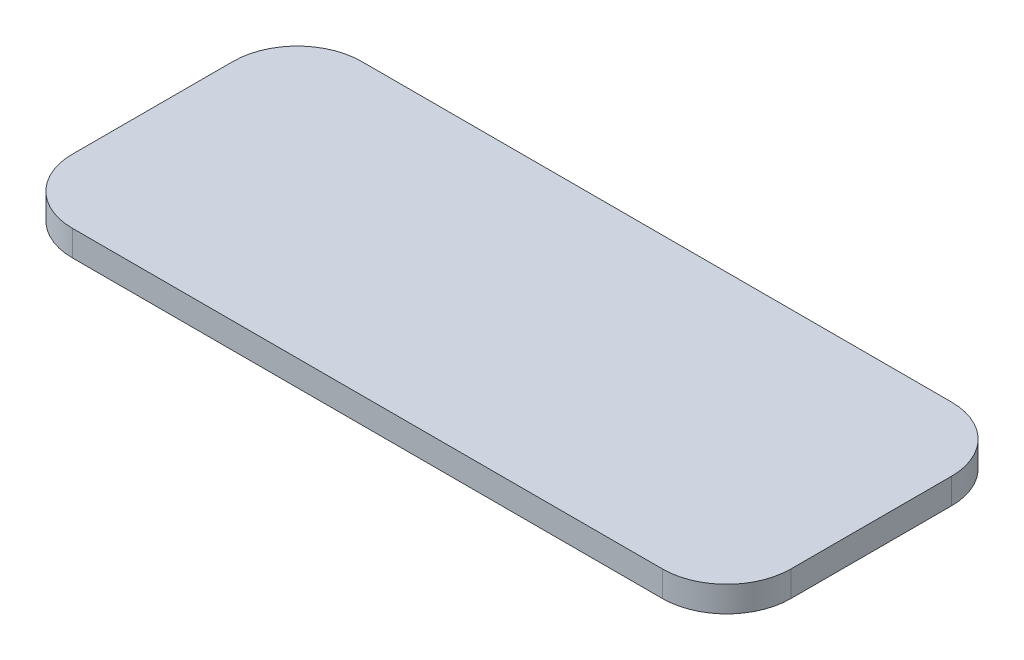
ISO-10303-21;
HEADER;
FILE_DESCRIPTION(('STEP AP214'),'2;1');
FILE_NAME('part.step','',(''),(''),'','','');
FILE_SCHEMA(('AUTOMOTIVE_DESIGN { 1 0 10303 214 1 1 1 1 }'));
ENDSEC;
DATA;
#1=APPLICATION_CONTEXT('core data for automotive mechanical design processes');
#2=APPLICATION_PROTOCOL_DEFINITION('international standard','automotive_design',2000,#1);
#3=PRODUCT_CONTEXT('',#1,'mechanical');
#4=PRODUCT('Part','Part','',(#3));
#5=PRODUCT_RELATED_PRODUCT_CATEGORY('part','',(#4));
#6=PRODUCT_DEFINITION_FORMATION('','',#4);
#7=PRODUCT_DEFINITION_CONTEXT('part definition',#1,'design');
#8=PRODUCT_DEFINITION('design','',#6,#7);
#9=PRODUCT_DEFINITION_SHAPE('','',#8);
#10=(LENGTH_UNIT() NAMED_UNIT(*) SI_UNIT(.MILLI.,.METRE.));
#11=(NAMED_UNIT(*) PLANE_ANGLE_UNIT() SI_UNIT($,.RADIAN.));
#12=(NAMED_UNIT(*) SI_UNIT($,.STERADIAN.) SOLID_ANGLE_UNIT());
#13=UNCERTAINTY_MEASURE_WITH_UNIT(LENGTH_MEASURE(1.E-05),#10,'distance_accuracy_value','');
#14=(GEOMETRIC_REPRESENTATION_CONTEXT(3) GLOBAL_UNCERTAINTY_ASSIGNED_CONTEXT((#13)) GLOBAL_UNIT_ASSIGNED_CONTEXT((#10,
#11,#12)) REPRESENTATION_CONTEXT('',''));
#15=CARTESIAN_POINT('',(0.,0.,0.));
#16=DIRECTION('',(0.,0.,1.));
#17=DIRECTION('',(1.,0.,0.));
#18=AXIS2_PLACEMENT_3D('',#15,#16,#17);
#19=CARTESIAN_POINT('',(29.8350195325224,2.,13.4832919551354));
#20=DIRECTION('',(0.,-1.,0.));
#21=DIRECTION('',(0.,0.,-1.));
#22=AXIS2_PLACEMENT_3D('',#19,#20,#21);
#23=CYLINDRICAL_SURFACE('',#22,5.);
#24=CARTESIAN_POINT('',(29.8350195325224,0.,13.4832919551354));
#25=DIRECTION('',(0.,1.,0.));
#26=DIRECTION('',(0.,0.,-1.));
#27=AXIS2_PLACEMENT_3D('',#24,#25,#26);
#28=CIRCLE('',#27,5.);
#29=CARTESIAN_POINT('',(29.8350195325224,0.,18.4832919551354));
#30=VERTEX_POINT('',#29);
#31=CARTESIAN_POINT('',(34.8350195325224,0.,13.4832919551354));
#32=VERTEX_POINT('',#31);
#33=EDGE_CURVE('E129',#30,#32,#28,.T.);
#34=ORIENTED_EDGE('',*,*,#33,.T.);
#35=DIRECTION('',(0.,-1.,0.));
#36=VECTOR('',#35,1.);
#37=CARTESIAN_POINT('',(34.8350195325224,2.,13.4832919551354));
#38=LINE('',#37,#36);
#39=CARTESIAN_POINT('',(34.8350195325224,2.,13.4832919551354));
#40=VERTEX_POINT('',#39);
#41=EDGE_CURVE('E11',#40,#32,#38,.T.);
#42=ORIENTED_EDGE('',*,*,#41,.F.);
#43=CARTESIAN_POINT('',(29.8350195325224,2.,13.4832919551354));
#44=DIRECTION('',(0.,1.,0.));
#45=DIRECTION('',(0.,0.,-1.));
#46=AXIS2_PLACEMENT_3D('',#43,#44,#45);
#47=CIRCLE('',#46,5.);
#48=CARTESIAN_POINT('',(29.8350195325224,2.,18.4832919551354));
#49=VERTEX_POINT('',#48);
#50=EDGE_CURVE('E143',#49,#40,#47,.T.);
#51=ORIENTED_EDGE('',*,*,#50,.F.);
#52=DIRECTION('',(0.,-1.,0.));
#53=VECTOR('',#52,1.);
#54=CARTESIAN_POINT('',(29.8350195325224,2.,18.4832919551354));
#55=LINE('',#54,#53);
#56=EDGE_CURVE('E125',#49,#30,#55,.T.);
#57=ORIENTED_EDGE('',*,*,#56,.T.);
#58=EDGE_LOOP('',(#34,#42,#51,#57));
#59=FACE_BOUND('',#58,.T.);
#60=ADVANCED_FACE('F33',(#59),#23,.T.);
#61=CARTESIAN_POINT('',(34.8350195325224,2.,0.968460178403462));
#62=DIRECTION('',(-1.,0.,0.));
#63=DIRECTION('',(0.,0.,1.));
#64=AXIS2_PLACEMENT_3D('',#61,#62,#63);
#65=PLANE('',#64);
#66=DIRECTION('',(0.,0.,-1.));
#67=VECTOR('',#66,1.);
#68=CARTESIAN_POINT('',(34.8350195325224,0.,0.968460178403462));
#69=LINE('',#68,#67);
#70=CARTESIAN_POINT('',(34.8350195325224,0.,0.968460178403462));
#71=VERTEX_POINT('',#70);
#72=EDGE_CURVE('E132',#32,#71,#69,.T.);
#73=ORIENTED_EDGE('',*,*,#72,.T.);
#74=DIRECTION('',(0.,-1.,0.));
#75=VECTOR('',#74,1.);
#76=CARTESIAN_POINT('',(34.8350195325224,2.,0.968460178403462));
#77=LINE('',#76,#75);
#78=CARTESIAN_POINT('',(34.8350195325224,2.,0.968460178403462));
#79=VERTEX_POINT('',#78);
#80=EDGE_CURVE('E41',#79,#71,#77,.T.);
#81=ORIENTED_EDGE('',*,*,#80,.F.);
#82=DIRECTION('',(0.,0.,-1.));
#83=VECTOR('',#82,1.);
#84=CARTESIAN_POINT('',(34.8350195325224,2.,0.968460178403462));
#85=LINE('',#84,#83);
#86=EDGE_CURVE('E92',#40,#79,#85,.T.);
#87=ORIENTED_EDGE('',*,*,#86,.F.);
#88=ORIENTED_EDGE('',*,*,#41,.T.);
#89=EDGE_LOOP('',(#73,#81,#87,#88));
#90=FACE_BOUND('',#89,.T.);
#91=ADVANCED_FACE('F178',(#90),#65,.F.);
#92=CARTESIAN_POINT('',(29.8350195325224,2.,0.968460178403462));
#93=DIRECTION('',(0.,-1.,0.));
#94=DIRECTION('',(0.,0.,-1.));
#95=AXIS2_PLACEMENT_3D('',#92,#93,#94);
#96=CYLINDRICAL_SURFACE('',#95,5.);
#97=CARTESIAN_POINT('',(29.8350195325224,0.,0.968460178403462));
#98=DIRECTION('',(0.,1.,0.));
#99=DIRECTION('',(0.,0.,-1.));
#100=AXIS2_PLACEMENT_3D('',#97,#98,#99);
#101=CIRCLE('',#100,5.);
#102=CARTESIAN_POINT('',(29.8350195325224,0.,-4.03153982159654));
#103=VERTEX_POINT('',#102);
#104=EDGE_CURVE('E134',#71,#103,#101,.T.);
#105=ORIENTED_EDGE('',*,*,#104,.T.);
#106=DIRECTION('',(0.,-1.,0.));
#107=VECTOR('',#106,1.);
#108=CARTESIAN_POINT('',(29.8350195325224,2.,-4.03153982159654));
#109=LINE('',#108,#107);
#110=CARTESIAN_POINT('',(29.8350195325224,2.,-4.03153982159654));
#111=VERTEX_POINT('',#110);
#112=EDGE_CURVE('E150',#111,#103,#109,.T.);
#113=ORIENTED_EDGE('',*,*,#112,.F.);
#114=CARTESIAN_POINT('',(29.8350195325224,2.,0.968460178403462));
#115=DIRECTION('',(0.,1.,0.));
#116=DIRECTION('',(0.,0.,-1.));
#117=AXIS2_PLACEMENT_3D('',#114,#115,#116);
#118=CIRCLE('',#117,5.);
#119=EDGE_CURVE('E158',#79,#111,#118,.T.);
#120=ORIENTED_EDGE('',*,*,#119,.F.);
#121=ORIENTED_EDGE('',*,*,#80,.T.);
#122=EDGE_LOOP('',(#105,#113,#120,#121));
#123=FACE_BOUND('',#122,.T.);
#124=ADVANCED_FACE('F156',(#123),#96,.T.);
#125=CARTESIAN_POINT('',(-16.1208689950695,2.,-4.03153982159622));
#126=DIRECTION('',(0.,0.,1.));
#127=DIRECTION('',(1.,0.,0.));
#128=AXIS2_PLACEMENT_3D('',#125,#126,#127);
#129=PLANE('',#128);
#130=DIRECTION('',(-1.,0.,0.));
#131=VECTOR('',#130,1.);
#132=CARTESIAN_POINT('',(-16.1208689950695,0.,-4.03153982159622));
#133=LINE('',#132,#131);
#134=CARTESIAN_POINT('',(-16.1208689950695,0.,-4.03153982159622));
#135=VERTEX_POINT('',#134);
#136=EDGE_CURVE('E136',#103,#135,#133,.T.);
#137=ORIENTED_EDGE('',*,*,#136,.T.);
#138=DIRECTION('',(0.,-1.,0.));
#139=VECTOR('',#138,1.);
#140=CARTESIAN_POINT('',(-16.1208689950695,2.,-4.03153982159622));
#141=LINE('',#140,#139);
#142=CARTESIAN_POINT('',(-16.1208689950695,2.,-4.03153982159622));
#143=VERTEX_POINT('',#142);
#144=EDGE_CURVE('E147',#143,#135,#141,.T.);
#145=ORIENTED_EDGE('',*,*,#144,.F.);
#146=DIRECTION('',(-1.,0.,0.));
#147=VECTOR('',#146,1.);
#148=CARTESIAN_POINT('',(-16.1208689950695,2.,-4.03153982159622));
#149=LINE('',#148,#147);
#150=EDGE_CURVE('E170',#111,#143,#149,.T.);
#151=ORIENTED_EDGE('',*,*,#150,.F.);
#152=ORIENTED_EDGE('',*,*,#112,.T.);
#153=EDGE_LOOP('',(#137,#145,#151,#152));
#154=FACE_BOUND('',#153,.T.);
#155=ADVANCED_FACE('F166',(#154),#129,.F.);
#156=CARTESIAN_POINT('',(-16.1208689950695,2.,0.968460178403781));
#157=DIRECTION('',(0.,-1.,0.));
#158=DIRECTION('',(0.,0.,-1.));
#159=AXIS2_PLACEMENT_3D('',#156,#157,#158);
#160=CYLINDRICAL_SURFACE('',#159,5.);
#161=CARTESIAN_POINT('',(-16.1208689950695,0.,0.968460178403781));
#162=DIRECTION('',(0.,1.,0.));
#163=DIRECTION('',(0.,0.,-1.));
#164=AXIS2_PLACEMENT_3D('',#161,#162,#163);
#165=CIRCLE('',#164,5.);
#166=CARTESIAN_POINT('',(-21.1208689950695,0.,0.968460178403781));
#167=VERTEX_POINT('',#166);
#168=EDGE_CURVE('E138',#135,#167,#165,.T.);
#169=ORIENTED_EDGE('',*,*,#168,.T.);
#170=DIRECTION('',(0.,-1.,0.));
#171=VECTOR('',#170,1.);
#172=CARTESIAN_POINT('',(-21.1208689950695,2.,0.968460178403781));
#173=LINE('',#172,#171);
#174=CARTESIAN_POINT('',(-21.1208689950695,2.,0.968460178403781));
#175=VERTEX_POINT('',#174);
#176=EDGE_CURVE('E120',#175,#167,#173,.T.);
#177=ORIENTED_EDGE('',*,*,#176,.F.);
#178=CARTESIAN_POINT('',(-16.1208689950695,2.,0.968460178403781));
#179=DIRECTION('',(0.,1.,0.));
#180=DIRECTION('',(0.,0.,-1.));
#181=AXIS2_PLACEMENT_3D('',#178,#179,#180);
#182=CIRCLE('',#181,5.);
#183=EDGE_CURVE('E111',#143,#175,#182,.T.);
#184=ORIENTED_EDGE('',*,*,#183,.F.);
#185=ORIENTED_EDGE('',*,*,#144,.T.);
#186=EDGE_LOOP('',(#169,#177,#184,#185));
#187=FACE_BOUND('',#186,.T.);
#188=ADVANCED_FACE('F169',(#187),#160,.T.);
#189=CARTESIAN_POINT('',(-21.1208689950695,2.,0.968460178403781));
#190=DIRECTION('',(1.,0.,0.));
#191=DIRECTION('',(0.,0.,-1.));
#192=AXIS2_PLACEMENT_3D('',#189,#190,#191);
#193=PLANE('',#192);
#194=DIRECTION('',(0.,0.,1.));
#195=VECTOR('',#194,1.);
#196=CARTESIAN_POINT('',(-21.1208689950695,0.,0.968460178403781));
#197=LINE('',#196,#195);
#198=CARTESIAN_POINT('',(-21.1208689950695,0.,13.4832919551354));
#199=VERTEX_POINT('',#198);
#200=EDGE_CURVE('E119',#167,#199,#197,.T.);
#201=ORIENTED_EDGE('',*,*,#200,.T.);
#202=DIRECTION('',(0.,-1.,0.));
#203=VECTOR('',#202,1.);
#204=CARTESIAN_POINT('',(-21.1208689950695,2.,13.4832919551354));
#205=LINE('',#204,#203);
#206=CARTESIAN_POINT('',(-21.1208689950695,2.,13.4832919551354));
#207=VERTEX_POINT('',#206);
#208=EDGE_CURVE('E116',#207,#199,#205,.T.);
#209=ORIENTED_EDGE('',*,*,#208,.F.);
#210=DIRECTION('',(0.,0.,1.));
#211=VECTOR('',#210,1.);
#212=CARTESIAN_POINT('',(-21.1208689950695,2.,0.968460178403781));
#213=LINE('',#212,#211);
#214=EDGE_CURVE('E105',#175,#207,#213,.T.);
#215=ORIENTED_EDGE('',*,*,#214,.F.);
#216=ORIENTED_EDGE('',*,*,#176,.T.);
#217=EDGE_LOOP('',(#201,#209,#215,#216));
#218=FACE_BOUND('',#217,.T.);
#219=ADVANCED_FACE('F117',(#218),#193,.F.);
#220=CARTESIAN_POINT('',(-16.1208689950695,2.,13.4832919551354));
#221=DIRECTION('',(0.,-1.,0.));
#222=DIRECTION('',(0.,0.,-1.));
#223=AXIS2_PLACEMENT_3D('',#220,#221,#222);
#224=CYLINDRICAL_SURFACE('',#223,5.);
#225=CARTESIAN_POINT('',(-16.1208689950695,0.,13.4832919551354));
#226=DIRECTION('',(0.,1.,0.));
#227=DIRECTION('',(0.,0.,1.));
#228=AXIS2_PLACEMENT_3D('',#225,#226,#227);
#229=CIRCLE('',#228,5.);
#230=CARTESIAN_POINT('',(-16.1208689950695,0.,18.4832919551354));
#231=VERTEX_POINT('',#230);
#232=EDGE_CURVE('E78',#199,#231,#229,.T.);
#233=ORIENTED_EDGE('',*,*,#232,.T.);
#234=DIRECTION('',(0.,-1.,0.));
#235=VECTOR('',#234,1.);
#236=CARTESIAN_POINT('',(-16.1208689950695,2.,18.4832919551354));
#237=LINE('',#236,#235);
#238=CARTESIAN_POINT('',(-16.1208689950695,2.,18.4832919551354));
#239=VERTEX_POINT('',#238);
#240=EDGE_CURVE('E121',#239,#231,#237,.T.);
#241=ORIENTED_EDGE('',*,*,#240,.F.);
#242=CARTESIAN_POINT('',(-16.1208689950695,2.,13.4832919551354));
#243=DIRECTION('',(0.,1.,0.));
#244=DIRECTION('',(0.,0.,1.));
#245=AXIS2_PLACEMENT_3D('',#242,#243,#244);
#246=CIRCLE('',#245,5.);
#247=EDGE_CURVE('E109',#207,#239,#246,.T.);
#248=ORIENTED_EDGE('',*,*,#247,.F.);
#249=ORIENTED_EDGE('',*,*,#208,.T.);
#250=EDGE_LOOP('',(#233,#241,#248,#249));
#251=FACE_BOUND('',#250,.T.);
#252=ADVANCED_FACE('F123',(#251),#224,.T.);
#253=CARTESIAN_POINT('',(-16.1208689950695,2.,18.4832919551354));
#254=DIRECTION('',(0.,0.,-1.));
#255=DIRECTION('',(-1.,0.,0.));
#256=AXIS2_PLACEMENT_3D('',#253,#254,#255);
#257=PLANE('',#256);
#258=DIRECTION('',(1.,0.,0.));
#259=VECTOR('',#258,1.);
#260=CARTESIAN_POINT('',(-16.1208689950695,0.,18.4832919551354));
#261=LINE('',#260,#259);
#262=EDGE_CURVE('E84',#231,#30,#261,.T.);
#263=ORIENTED_EDGE('',*,*,#262,.T.);
#264=ORIENTED_EDGE('',*,*,#56,.F.);
#265=DIRECTION('',(1.,0.,0.));
#266=VECTOR('',#265,1.);
#267=CARTESIAN_POINT('',(-16.1208689950695,2.,18.4832919551354));
#268=LINE('',#267,#266);
#269=EDGE_CURVE('E49',#239,#49,#268,.T.);
#270=ORIENTED_EDGE('',*,*,#269,.F.);
#271=ORIENTED_EDGE('',*,*,#240,.T.);
#272=EDGE_LOOP('',(#263,#264,#270,#271));
#273=FACE_BOUND('',#272,.T.);
#274=ADVANCED_FACE('F194',(#273),#257,.F.);
#275=CARTESIAN_POINT('',(29.8350195325224,2.,13.4832919551354));
#276=DIRECTION('',(0.,-1.,0.));
#277=DIRECTION('',(0.,0.,-1.));
#278=AXIS2_PLACEMENT_3D('',#275,#276,#277);
#279=PLANE('',#278);
#280=ORIENTED_EDGE('',*,*,#50,.T.);
#281=ORIENTED_EDGE('',*,*,#86,.T.);
#282=ORIENTED_EDGE('',*,*,#119,.T.);
#283=ORIENTED_EDGE('',*,*,#150,.T.);
#284=ORIENTED_EDGE('',*,*,#183,.T.);
#285=ORIENTED_EDGE('',*,*,#214,.T.);
#286=ORIENTED_EDGE('',*,*,#247,.T.);
#287=ORIENTED_EDGE('',*,*,#269,.T.);
#288=EDGE_LOOP('',(#280,#281,#282,#283,#284,#285,#286,#287));
#289=FACE_BOUND('',#288,.T.);
#290=ADVANCED_FACE('F107',(#289),#279,.F.);
#291=CARTESIAN_POINT('',(29.8350195325224,0.,13.4832919551354));
#292=DIRECTION('',(0.,-1.,0.));
#293=DIRECTION('',(0.,0.,-1.));
#294=AXIS2_PLACEMENT_3D('',#291,#292,#293);
#295=PLANE('',#294);
#296=ORIENTED_EDGE('',*,*,#33,.F.);
#297=ORIENTED_EDGE('',*,*,#262,.F.);
#298=ORIENTED_EDGE('',*,*,#232,.F.);
#299=ORIENTED_EDGE('',*,*,#200,.F.);
#300=ORIENTED_EDGE('',*,*,#168,.F.);
#301=ORIENTED_EDGE('',*,*,#136,.F.);
#302=ORIENTED_EDGE('',*,*,#104,.F.);
#303=ORIENTED_EDGE('',*,*,#72,.F.);
#304=EDGE_LOOP('',(#296,#297,#298,#299,#300,#301,#302,#303));
#305=FACE_BOUND('',#304,.T.);
#306=ADVANCED_FACE('F162',(#305),#295,.T.);
#307=CLOSED_SHELL('',(#60,#91,#124,#155,#188,#219,#252,#274,#290,#306));
#308=MANIFOLD_SOLID_BREP('B2',#307);
#309=ADVANCED_BREP_SHAPE_REPRESENTATION('',(#18,#308),#14);
#310=SHAPE_DEFINITION_REPRESENTATION(#9,#309);
ENDSEC;
END-ISO-10303-21;
